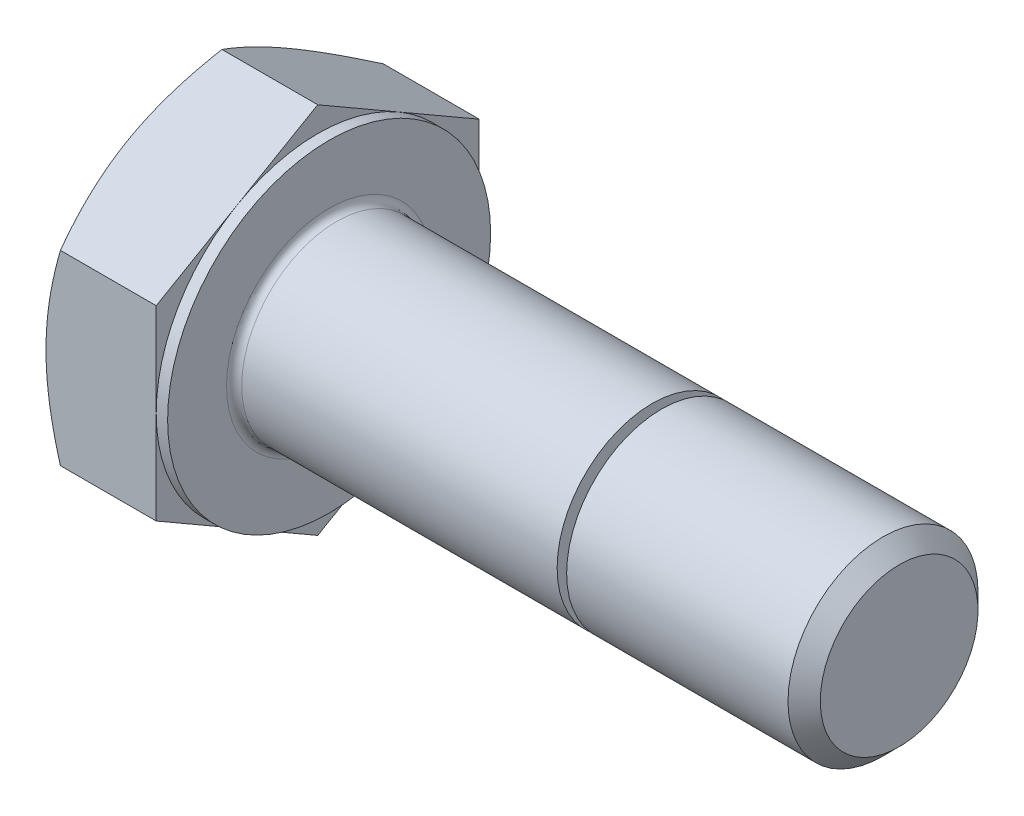
ISO-10303-21;
HEADER;
FILE_DESCRIPTION(('STEP AP214'),'2;1');
FILE_NAME('part.step','',(''),(''),'','','');
FILE_SCHEMA(('AUTOMOTIVE_DESIGN { 1 0 10303 214 1 1 1 1 }'));
ENDSEC;
DATA;
#1=APPLICATION_CONTEXT('core data for automotive mechanical design processes');
#2=APPLICATION_PROTOCOL_DEFINITION('international standard','automotive_design',2000,#1);
#3=PRODUCT_CONTEXT('',#1,'mechanical');
#4=PRODUCT('Part','Part','',(#3));
#5=PRODUCT_RELATED_PRODUCT_CATEGORY('part','',(#4));
#6=PRODUCT_DEFINITION_FORMATION('','',#4);
#7=PRODUCT_DEFINITION_CONTEXT('part definition',#1,'design');
#8=PRODUCT_DEFINITION('design','',#6,#7);
#9=PRODUCT_DEFINITION_SHAPE('','',#8);
#10=(LENGTH_UNIT() NAMED_UNIT(*) SI_UNIT(.MILLI.,.METRE.));
#11=(NAMED_UNIT(*) PLANE_ANGLE_UNIT() SI_UNIT($,.RADIAN.));
#12=(NAMED_UNIT(*) SI_UNIT($,.STERADIAN.) SOLID_ANGLE_UNIT());
#13=UNCERTAINTY_MEASURE_WITH_UNIT(LENGTH_MEASURE(1.E-05),#10,'distance_accuracy_value','');
#14=(GEOMETRIC_REPRESENTATION_CONTEXT(3) GLOBAL_UNCERTAINTY_ASSIGNED_CONTEXT((#13)) GLOBAL_UNIT_ASSIGNED_CONTEXT((#10,
#11,#12)) REPRESENTATION_CONTEXT('',''));
#15=CARTESIAN_POINT('',(0.,0.,0.));
#16=DIRECTION('',(0.,0.,1.));
#17=DIRECTION('',(1.,0.,0.));
#18=AXIS2_PLACEMENT_3D('',#15,#16,#17);
#19=CARTESIAN_POINT('',(6.4,9.814954576,0.));
#20=DIRECTION('',(-1.,0.,0.));
#21=DIRECTION('',(0.,0.,1.));
#22=AXIS2_PLACEMENT_3D('',#19,#20,#21);
#23=PLANE('',#22);
#24=CARTESIAN_POINT('',(6.4,0.,0.));
#25=DIRECTION('',(1.,0.,0.));
#26=DIRECTION('',(0.,0.,1.));
#27=AXIS2_PLACEMENT_3D('',#24,#25,#26);
#28=CIRCLE('',#27,5.4);
#29=CARTESIAN_POINT('',(6.4,0.,-5.4));
#30=VERTEX_POINT('',#29);
#31=EDGE_CURVE('E187',#30,#30,#28,.T.);
#32=ORIENTED_EDGE('',*,*,#31,.F.);
#33=EDGE_LOOP('',(#32));
#34=FACE_BOUND('',#33,.T.);
#35=CARTESIAN_POINT('',(6.4,0.,0.));
#36=DIRECTION('',(-1.,0.,0.));
#37=DIRECTION('',(0.,0.,1.));
#38=AXIS2_PLACEMENT_3D('',#35,#36,#37);
#39=CIRCLE('',#38,8.5);
#40=CARTESIAN_POINT('',(6.4,0.,8.5));
#41=VERTEX_POINT('',#40);
#42=EDGE_CURVE('E257',#41,#41,#39,.T.);
#43=ORIENTED_EDGE('',*,*,#42,.F.);
#44=EDGE_LOOP('',(#43));
#45=FACE_BOUND('',#44,.T.);
#46=ADVANCED_FACE('F17',(#34,#45),#23,.F.);
#47=CARTESIAN_POINT('',(36.4,0.,0.));
#48=DIRECTION('',(1.,0.,0.));
#49=DIRECTION('',(0.,1.,0.));
#50=AXIS2_PLACEMENT_3D('',#47,#48,#49);
#51=PLANE('',#50);
#52=CARTESIAN_POINT('',(36.4,0.,0.));
#53=DIRECTION('',(-1.,0.,0.));
#54=DIRECTION('',(0.,0.,1.));
#55=AXIS2_PLACEMENT_3D('',#52,#53,#54);
#56=CIRCLE('',#55,4.15);
#57=CARTESIAN_POINT('',(36.4,-2.43930879701376,3.35742052665604));
#58=VERTEX_POINT('',#57);
#59=EDGE_CURVE('E185',#58,#58,#56,.T.);
#60=ORIENTED_EDGE('',*,*,#59,.F.);
#61=EDGE_LOOP('',(#60));
#62=FACE_BOUND('',#61,.T.);
#63=ADVANCED_FACE('F503',(#62),#51,.T.);
#64=CARTESIAN_POINT('',(5.8,8.5,0.));
#65=DIRECTION('',(-1.,0.,0.));
#66=DIRECTION('',(0.,0.,1.));
#67=AXIS2_PLACEMENT_3D('',#64,#65,#66);
#68=PLANE('',#67);
#69=DIRECTION('',(0.,0.499999999991456,0.866025403789372));
#70=VECTOR('',#69,1.);
#71=CARTESIAN_POINT('',(5.8,-7.361215932,4.25));
#72=LINE('',#71,#70);
#73=CARTESIAN_POINT('',(5.8,-7.361215932,4.25));
#74=VERTEX_POINT('',#73);
#75=CARTESIAN_POINT('',(5.8,-4.907477288,8.5));
#76=VERTEX_POINT('',#75);
#77=EDGE_CURVE('E207',#74,#76,#72,.T.);
#78=ORIENTED_EDGE('',*,*,#77,.F.);
#79=CARTESIAN_POINT('',(5.8,0.,0.));
#80=DIRECTION('',(1.,0.,0.));
#81=DIRECTION('',(0.,0.,1.));
#82=AXIS2_PLACEMENT_3D('',#79,#80,#81);
#83=CIRCLE('',#82,8.5);
#84=CARTESIAN_POINT('',(5.8,0.,8.5));
#85=VERTEX_POINT('',#84);
#86=EDGE_CURVE('E260',#85,#74,#83,.T.);
#87=ORIENTED_EDGE('',*,*,#86,.F.);
#88=DIRECTION('',(0.,1.,0.));
#89=VECTOR('',#88,1.);
#90=CARTESIAN_POINT('',(5.8,-4.907477288,8.5));
#91=LINE('',#90,#89);
#92=EDGE_CURVE('E401',#76,#85,#91,.T.);
#93=ORIENTED_EDGE('',*,*,#92,.F.);
#94=EDGE_LOOP('',(#78,#87,#93));
#95=FACE_BOUND('',#94,.T.);
#96=ADVANCED_FACE('F513',(#95),#68,.F.);
#97=CARTESIAN_POINT('',(5.8,8.5,0.));
#98=DIRECTION('',(-1.,0.,0.));
#99=DIRECTION('',(0.,0.,1.));
#100=AXIS2_PLACEMENT_3D('',#97,#98,#99);
#101=PLANE('',#100);
#102=DIRECTION('',(0.,-0.499999999991455,0.866025403789372));
#103=VECTOR('',#102,1.);
#104=CARTESIAN_POINT('',(5.8,-7.361215932,-4.25));
#105=LINE('',#104,#103);
#106=CARTESIAN_POINT('',(5.8,-7.361215932,-4.25));
#107=VERTEX_POINT('',#106);
#108=CARTESIAN_POINT('',(5.8,-9.814954576,0.));
#109=VERTEX_POINT('',#108);
#110=EDGE_CURVE('E378',#107,#109,#105,.T.);
#111=ORIENTED_EDGE('',*,*,#110,.F.);
#112=CARTESIAN_POINT('',(5.8,0.,0.));
#113=DIRECTION('',(1.,0.,0.));
#114=DIRECTION('',(0.,-0.866025403784446,0.499999999999987));
#115=AXIS2_PLACEMENT_3D('',#112,#113,#114);
#116=CIRCLE('',#115,8.5);
#117=EDGE_CURVE('E274',#74,#107,#116,.T.);
#118=ORIENTED_EDGE('',*,*,#117,.F.);
#119=DIRECTION('',(0.,0.499999999991455,0.866025403789372));
#120=VECTOR('',#119,1.);
#121=CARTESIAN_POINT('',(5.8,-9.814954576,0.));
#122=LINE('',#121,#120);
#123=EDGE_CURVE('E204',#109,#74,#122,.T.);
#124=ORIENTED_EDGE('',*,*,#123,.F.);
#125=EDGE_LOOP('',(#111,#118,#124));
#126=FACE_BOUND('',#125,.T.);
#127=ADVANCED_FACE('F515',(#126),#101,.F.);
#128=CARTESIAN_POINT('',(5.8,8.5,0.));
#129=DIRECTION('',(-1.,0.,0.));
#130=DIRECTION('',(0.,0.,1.));
#131=AXIS2_PLACEMENT_3D('',#128,#129,#130);
#132=PLANE('',#131);
#133=DIRECTION('',(0.,-1.,0.));
#134=VECTOR('',#133,1.);
#135=CARTESIAN_POINT('',(5.8,0.,-8.5));
#136=LINE('',#135,#134);
#137=CARTESIAN_POINT('',(5.8,0.,-8.5));
#138=VERTEX_POINT('',#137);
#139=CARTESIAN_POINT('',(5.8,-4.907477288,-8.5));
#140=VERTEX_POINT('',#139);
#141=EDGE_CURVE('E359',#138,#140,#136,.T.);
#142=ORIENTED_EDGE('',*,*,#141,.F.);
#143=CARTESIAN_POINT('',(5.8,0.,0.));
#144=DIRECTION('',(1.,0.,0.));
#145=DIRECTION('',(0.,-0.866025403784431,-0.500000000000014));
#146=AXIS2_PLACEMENT_3D('',#143,#144,#145);
#147=CIRCLE('',#146,8.5);
#148=EDGE_CURVE('E226',#107,#138,#147,.T.);
#149=ORIENTED_EDGE('',*,*,#148,.F.);
#150=DIRECTION('',(0.,-0.499999999991456,0.866025403789372));
#151=VECTOR('',#150,1.);
#152=CARTESIAN_POINT('',(5.8,-4.907477288,-8.5));
#153=LINE('',#152,#151);
#154=EDGE_CURVE('E292',#140,#107,#153,.T.);
#155=ORIENTED_EDGE('',*,*,#154,.F.);
#156=EDGE_LOOP('',(#142,#149,#155));
#157=FACE_BOUND('',#156,.T.);
#158=ADVANCED_FACE('F519',(#157),#132,.F.);
#159=CARTESIAN_POINT('',(5.8,8.5,0.));
#160=DIRECTION('',(-1.,0.,0.));
#161=DIRECTION('',(0.,0.,1.));
#162=AXIS2_PLACEMENT_3D('',#159,#160,#161);
#163=PLANE('',#162);
#164=DIRECTION('',(0.,-0.499999999991456,-0.866025403789372));
#165=VECTOR('',#164,1.);
#166=CARTESIAN_POINT('',(5.8,7.361215932,-4.25));
#167=LINE('',#166,#165);
#168=CARTESIAN_POINT('',(5.8,7.361215932,-4.25));
#169=VERTEX_POINT('',#168);
#170=CARTESIAN_POINT('',(5.8,4.907477288,-8.5));
#171=VERTEX_POINT('',#170);
#172=EDGE_CURVE('E340',#169,#171,#167,.T.);
#173=ORIENTED_EDGE('',*,*,#172,.F.);
#174=CARTESIAN_POINT('',(5.8,0.,0.));
#175=DIRECTION('',(1.,0.,0.));
#176=DIRECTION('',(0.,0.,-1.));
#177=AXIS2_PLACEMENT_3D('',#174,#175,#176);
#178=CIRCLE('',#177,8.5);
#179=EDGE_CURVE('E227',#138,#169,#178,.T.);
#180=ORIENTED_EDGE('',*,*,#179,.F.);
#181=DIRECTION('',(0.,-1.,0.));
#182=VECTOR('',#181,1.);
#183=CARTESIAN_POINT('',(5.8,4.907477288,-8.5));
#184=LINE('',#183,#182);
#185=EDGE_CURVE('E266',#171,#138,#184,.T.);
#186=ORIENTED_EDGE('',*,*,#185,.F.);
#187=EDGE_LOOP('',(#173,#180,#186));
#188=FACE_BOUND('',#187,.T.);
#189=ADVANCED_FACE('F522',(#188),#163,.F.);
#190=CARTESIAN_POINT('',(5.8,8.5,0.));
#191=DIRECTION('',(-1.,0.,0.));
#192=DIRECTION('',(0.,0.,1.));
#193=AXIS2_PLACEMENT_3D('',#190,#191,#192);
#194=PLANE('',#193);
#195=DIRECTION('',(0.,0.499999999991455,-0.866025403789372));
#196=VECTOR('',#195,1.);
#197=CARTESIAN_POINT('',(5.8,7.361215932,4.25));
#198=LINE('',#197,#196);
#199=CARTESIAN_POINT('',(5.8,7.361215932,4.25));
#200=VERTEX_POINT('',#199);
#201=CARTESIAN_POINT('',(5.8,9.814954576,0.));
#202=VERTEX_POINT('',#201);
#203=EDGE_CURVE('E282',#200,#202,#198,.T.);
#204=ORIENTED_EDGE('',*,*,#203,.F.);
#205=CARTESIAN_POINT('',(5.8,0.,0.));
#206=DIRECTION('',(1.,0.,0.));
#207=DIRECTION('',(0.,0.866025403784438,-0.5));
#208=AXIS2_PLACEMENT_3D('',#205,#206,#207);
#209=CIRCLE('',#208,8.5);
#210=EDGE_CURVE('E231',#169,#200,#209,.T.);
#211=ORIENTED_EDGE('',*,*,#210,.F.);
#212=DIRECTION('',(0.,-0.499999999991455,-0.866025403789372));
#213=VECTOR('',#212,1.);
#214=CARTESIAN_POINT('',(5.8,9.814954576,0.));
#215=LINE('',#214,#213);
#216=EDGE_CURVE('E336',#202,#169,#215,.T.);
#217=ORIENTED_EDGE('',*,*,#216,.F.);
#218=EDGE_LOOP('',(#204,#211,#217));
#219=FACE_BOUND('',#218,.T.);
#220=ADVANCED_FACE('F524',(#219),#194,.F.);
#221=CARTESIAN_POINT('',(5.8,8.5,0.));
#222=DIRECTION('',(-1.,0.,0.));
#223=DIRECTION('',(0.,0.,1.));
#224=AXIS2_PLACEMENT_3D('',#221,#222,#223);
#225=PLANE('',#224);
#226=DIRECTION('',(0.,0.499999999991456,-0.866025403789372));
#227=VECTOR('',#226,1.);
#228=CARTESIAN_POINT('',(5.8,4.907477288,8.5));
#229=LINE('',#228,#227);
#230=CARTESIAN_POINT('',(5.8,4.907477288,8.5));
#231=VERTEX_POINT('',#230);
#232=EDGE_CURVE('E278',#231,#200,#229,.T.);
#233=ORIENTED_EDGE('',*,*,#232,.F.);
#234=DIRECTION('',(0.,1.,0.));
#235=VECTOR('',#234,1.);
#236=CARTESIAN_POINT('',(5.8,0.,8.5));
#237=LINE('',#236,#235);
#238=EDGE_CURVE('E410',#85,#231,#237,.T.);
#239=ORIENTED_EDGE('',*,*,#238,.F.);
#240=CARTESIAN_POINT('',(5.8,0.,0.));
#241=DIRECTION('',(1.,0.,0.));
#242=DIRECTION('',(0.,0.866025403784438,0.5));
#243=AXIS2_PLACEMENT_3D('',#240,#241,#242);
#244=CIRCLE('',#243,8.5);
#245=EDGE_CURVE('E239',#200,#85,#244,.T.);
#246=ORIENTED_EDGE('',*,*,#245,.F.);
#247=EDGE_LOOP('',(#233,#239,#246));
#248=FACE_BOUND('',#247,.T.);
#249=ADVANCED_FACE('F530',(#248),#225,.F.);
#250=CARTESIAN_POINT('',(0.,9.814954576,0.));
#251=DIRECTION('',(-1.,0.,0.));
#252=DIRECTION('',(0.,0.,1.));
#253=AXIS2_PLACEMENT_3D('',#250,#251,#252);
#254=PLANE('',#253);
#255=CARTESIAN_POINT('',(0.,0.,0.));
#256=DIRECTION('',(-1.,0.,0.));
#257=DIRECTION('',(0.,0.,1.));
#258=AXIS2_PLACEMENT_3D('',#255,#256,#257);
#259=CIRCLE('',#258,8.5);
#260=CARTESIAN_POINT('',(0.,0.,8.5));
#261=VERTEX_POINT('',#260);
#262=CARTESIAN_POINT('',(0.,7.361215932,4.25));
#263=VERTEX_POINT('',#262);
#264=EDGE_CURVE('E11',#261,#263,#259,.T.);
#265=ORIENTED_EDGE('',*,*,#264,.T.);
#266=CARTESIAN_POINT('',(0.,0.,0.));
#267=DIRECTION('',(-1.,0.,0.));
#268=DIRECTION('',(0.,0.866025403784438,0.5));
#269=AXIS2_PLACEMENT_3D('',#266,#267,#268);
#270=CIRCLE('',#269,8.5);
#271=CARTESIAN_POINT('',(0.,7.361215932,-4.25));
#272=VERTEX_POINT('',#271);
#273=EDGE_CURVE('E25',#263,#272,#270,.T.);
#274=ORIENTED_EDGE('',*,*,#273,.T.);
#275=CARTESIAN_POINT('',(0.,0.,0.));
#276=DIRECTION('',(1.,0.,0.));
#277=DIRECTION('',(0.,0.,-1.));
#278=AXIS2_PLACEMENT_3D('',#275,#276,#277);
#279=CIRCLE('',#278,8.5);
#280=CARTESIAN_POINT('',(0.,0.,-8.5));
#281=VERTEX_POINT('',#280);
#282=EDGE_CURVE('E385',#281,#272,#279,.T.);
#283=ORIENTED_EDGE('',*,*,#282,.F.);
#284=CARTESIAN_POINT('',(0.,0.,0.));
#285=DIRECTION('',(-1.,0.,0.));
#286=DIRECTION('',(0.,0.,-1.));
#287=AXIS2_PLACEMENT_3D('',#284,#285,#286);
#288=CIRCLE('',#287,8.5);
#289=CARTESIAN_POINT('',(0.,-7.361215932,-4.25));
#290=VERTEX_POINT('',#289);
#291=EDGE_CURVE('E382',#281,#290,#288,.T.);
#292=ORIENTED_EDGE('',*,*,#291,.T.);
#293=CARTESIAN_POINT('',(0.,0.,0.));
#294=DIRECTION('',(-1.,0.,0.));
#295=DIRECTION('',(0.,-0.866025403784444,-0.49999999999999));
#296=AXIS2_PLACEMENT_3D('',#293,#294,#295);
#297=CIRCLE('',#296,8.5);
#298=CARTESIAN_POINT('',(0.,-7.361215932,4.25));
#299=VERTEX_POINT('',#298);
#300=EDGE_CURVE('E44',#290,#299,#297,.T.);
#301=ORIENTED_EDGE('',*,*,#300,.T.);
#302=CARTESIAN_POINT('',(0.,0.,0.));
#303=DIRECTION('',(-1.,0.,0.));
#304=DIRECTION('',(0.,-0.866025403784432,0.500000000000012));
#305=AXIS2_PLACEMENT_3D('',#302,#303,#304);
#306=CIRCLE('',#305,8.5);
#307=EDGE_CURVE('E249',#299,#261,#306,.T.);
#308=ORIENTED_EDGE('',*,*,#307,.T.);
#309=EDGE_LOOP('',(#265,#274,#283,#292,#301,#308));
#310=FACE_BOUND('',#309,.T.);
#311=ADVANCED_FACE('F428',(#310),#254,.T.);
#312=CARTESIAN_POINT('',(0.687370063500056,0.,0.));
#313=DIRECTION('',(1.,0.,0.));
#314=DIRECTION('',(0.,0.587785252292474,0.809016994374947));
#315=AXIS2_PLACEMENT_3D('',#312,#313,#314);
#316=CONICAL_SURFACE('',#315,9.69055987360002,1.04719755120247);
#317=CARTESIAN_POINT('',(-3.6123028236179E-10,7.36121593154684,4.24999999982385));
#318=CARTESIAN_POINT('',(-1.9507866547565E-10,6.22243186396579,6.22243186421516));
#319=CARTESIAN_POINT('',(0.759189378550385,4.90747728793407,8.50000000011419));
#320=(BOUNDED_CURVE() B_SPLINE_CURVE(2,(#317,#318,#319),.UNSPECIFIED.,.F.,
.F.) B_SPLINE_CURVE_WITH_KNOTS((3,3),(1.96261324119927,2.78463308145665),
.UNSPECIFIED.) CURVE() GEOMETRIC_REPRESENTATION_ITEM() RATIONAL_B_SPLINE_CURVE((1.69282032312476,
1.6928203230961,1.57128129213758)) REPRESENTATION_ITEM(''));
#321=CARTESIAN_POINT('',(0.759189379,4.907477288,8.5));
#322=VERTEX_POINT('',#321);
#323=EDGE_CURVE('E316',#263,#322,#320,.T.);
#324=ORIENTED_EDGE('',*,*,#323,.F.);
#325=ORIENTED_EDGE('',*,*,#264,.F.);
#326=CARTESIAN_POINT('',(0.759189378550386,4.90747728813186,8.50000000000001));
#327=CARTESIAN_POINT('',(0.,2.2775681356726,8.50000000000001));
#328=CARTESIAN_POINT('',(0.,0.,8.5));
#329=(BOUNDED_CURVE() B_SPLINE_CURVE(2,(#326,#327,#328),.UNSPECIFIED.,.F.,
.F.) B_SPLINE_CURVE_WITH_KNOTS((3,3),(1.14059340071008,1.96261324096582),
.UNSPECIFIED.) CURVE() GEOMETRIC_REPRESENTATION_ITEM() RATIONAL_B_SPLINE_CURVE((1.57128129211806,
1.69282032303694,1.69282032303695)) REPRESENTATION_ITEM(''));
#330=EDGE_CURVE('E250',#322,#261,#329,.T.);
#331=ORIENTED_EDGE('',*,*,#330,.F.);
#332=EDGE_LOOP('',(#324,#325,#331));
#333=FACE_BOUND('',#332,.T.);
#334=ADVANCED_FACE('F545',(#333),#316,.T.);
#335=CARTESIAN_POINT('',(0.687370063500056,0.,0.));
#336=DIRECTION('',(1.,0.,0.));
#337=DIRECTION('',(0.,0.587785252292474,0.809016994374947));
#338=AXIS2_PLACEMENT_3D('',#335,#336,#337);
#339=CONICAL_SURFACE('',#338,9.69055987360002,1.04719755120247);
#340=CARTESIAN_POINT('',(1.93613933889761E-10,7.36121593237913,-4.25000000030435));
#341=CARTESIAN_POINT('',(2.74674250522949E-11,8.50000000007917,-2.27756813570699));
#342=CARTESIAN_POINT('',(0.759189378461005,9.81495457607884,1.36552628096186E-10));
#343=(BOUNDED_CURVE() B_SPLINE_CURVE(2,(#340,#341,#342),.UNSPECIFIED.,.F.,
.F.) B_SPLINE_CURVE_WITH_KNOTS((3,3),(1.96261324075079,2.78463308105072),
.UNSPECIFIED.) CURVE() GEOMETRIC_REPRESENTATION_ITEM() RATIONAL_B_SPLINE_CURVE((1.6928203229899,
1.69282032301855,1.57128129212089)) REPRESENTATION_ITEM(''));
#344=CARTESIAN_POINT('',(0.759189378492819,9.81495457579647,-1.97129170330632E-10));
#345=VERTEX_POINT('',#344);
#346=EDGE_CURVE('E261',#272,#345,#343,.T.);
#347=ORIENTED_EDGE('',*,*,#346,.F.);
#348=ORIENTED_EDGE('',*,*,#273,.F.);
#349=CARTESIAN_POINT('',(0.759189378017451,9.81495457531058,-7.27940775002685E-10));
#350=CARTESIAN_POINT('',(-5.27382137960331E-10,8.49999999925537,2.27756813521179));
#351=CARTESIAN_POINT('',(-3.6123028236179E-10,7.36121593154684,4.24999999982385));
#352=(BOUNDED_CURVE() B_SPLINE_CURVE(2,(#349,#350,#351),.UNSPECIFIED.,.F.,
.F.) B_SPLINE_CURVE_WITH_KNOTS((3,3),(1.14059340082205,1.96261324119927),
.UNSPECIFIED.) CURVE() GEOMETRIC_REPRESENTATION_ITEM() RATIONAL_B_SPLINE_CURVE((1.57128129221677,
1.69282032315342,1.69282032312476)) REPRESENTATION_ITEM(''));
#353=EDGE_CURVE('E300',#345,#263,#352,.T.);
#354=ORIENTED_EDGE('',*,*,#353,.F.);
#355=EDGE_LOOP('',(#347,#348,#354));
#356=FACE_BOUND('',#355,.T.);
#357=ADVANCED_FACE('F437',(#356),#339,.T.);
#358=CARTESIAN_POINT('',(0.687370063500056,0.,0.));
#359=DIRECTION('',(1.,0.,0.));
#360=DIRECTION('',(0.,0.587785252292474,0.809016994374947));
#361=AXIS2_PLACEMENT_3D('',#358,#359,#360);
#362=CONICAL_SURFACE('',#361,9.69055987360002,1.04719755120247);
#363=CARTESIAN_POINT('',(0.,0.,-8.5));
#364=CARTESIAN_POINT('',(0.,2.27756813567261,-8.5));
#365=CARTESIAN_POINT('',(0.759189378550382,4.90747728813188,-8.49999999999999));
#366=(BOUNDED_CURVE() B_SPLINE_CURVE(2,(#363,#364,#365),.UNSPECIFIED.,.F.,
.F.) B_SPLINE_CURVE_WITH_KNOTS((3,3),(1.96261324096584,2.78463308122159),
.UNSPECIFIED.) CURVE() GEOMETRIC_REPRESENTATION_ITEM() RATIONAL_B_SPLINE_CURVE((1.69282032303695,
1.69282032303695,1.57128129211806)) REPRESENTATION_ITEM(''));
#367=CARTESIAN_POINT('',(0.759189379,4.907477288,-8.5));
#368=VERTEX_POINT('',#367);
#369=EDGE_CURVE('E287',#281,#368,#366,.T.);
#370=ORIENTED_EDGE('',*,*,#369,.F.);
#371=ORIENTED_EDGE('',*,*,#282,.T.);
#372=CARTESIAN_POINT('',(0.759189378993931,4.90747728883036,-8.50000000048384));
#373=CARTESIAN_POINT('',(3.59763108193079E-10,6.22243186480654,-6.22243186468099));
#374=CARTESIAN_POINT('',(1.93613933889762E-10,7.36121593237913,-4.25000000030437));
#375=(BOUNDED_CURVE() B_SPLINE_CURVE(2,(#372,#373,#374),.UNSPECIFIED.,.F.,
.F.) B_SPLINE_CURVE_WITH_KNOTS((3,3),(1.14059340057068,1.96261324075079),
.UNSPECIFIED.) CURVE() GEOMETRIC_REPRESENTATION_ITEM() RATIONAL_B_SPLINE_CURVE((1.5712812920417,
1.69282032296124,1.6928203229899)) REPRESENTATION_ITEM(''));
#376=EDGE_CURVE('E267',#368,#272,#375,.T.);
#377=ORIENTED_EDGE('',*,*,#376,.F.);
#378=EDGE_LOOP('',(#370,#371,#377));
#379=FACE_BOUND('',#378,.T.);
#380=ADVANCED_FACE('F436',(#379),#362,.T.);
#381=CARTESIAN_POINT('',(0.687370063500056,0.,0.));
#382=DIRECTION('',(1.,0.,0.));
#383=DIRECTION('',(0.,-0.499999999995726,-0.866025403786906));
#384=AXIS2_PLACEMENT_3D('',#381,#382,#383);
#385=CONICAL_SURFACE('',#384,9.69055987360002,1.04719755120247);
#386=CARTESIAN_POINT('',(0.759189378550364,-4.90747728813187,-8.5));
#387=CARTESIAN_POINT('',(0.,-2.2775681356726,-8.5));
#388=CARTESIAN_POINT('',(0.,0.,-8.5));
#389=(BOUNDED_CURVE() B_SPLINE_CURVE(2,(#386,#387,#388),.UNSPECIFIED.,.F.,
.F.) B_SPLINE_CURVE_WITH_KNOTS((3,3),(1.14059340071008,1.96261324096584),
.UNSPECIFIED.) CURVE() GEOMETRIC_REPRESENTATION_ITEM() RATIONAL_B_SPLINE_CURVE((1.57128129211807,
1.69282032303695,1.69282032303695)) REPRESENTATION_ITEM(''));
#390=CARTESIAN_POINT('',(0.759189379,-4.907477288,-8.5));
#391=VERTEX_POINT('',#390);
#392=EDGE_CURVE('E293',#391,#281,#389,.T.);
#393=ORIENTED_EDGE('',*,*,#392,.F.);
#394=CARTESIAN_POINT('',(1.93582715800486E-10,-7.36121593237912,-4.25000000030436));
#395=CARTESIAN_POINT('',(3.59735856797279E-10,-6.22243186480654,-6.22243186468098));
#396=CARTESIAN_POINT('',(0.759189378993909,-4.90747728883036,-8.50000000048382));
#397=(BOUNDED_CURVE() B_SPLINE_CURVE(2,(#394,#395,#396),.UNSPECIFIED.,.F.,
.F.) B_SPLINE_CURVE_WITH_KNOTS((3,3),(1.96261324113843,2.78463308131853),
.UNSPECIFIED.) CURVE() GEOMETRIC_REPRESENTATION_ITEM() RATIONAL_B_SPLINE_CURVE((1.69282032298991,
1.69282032296125,1.5712812920417)) REPRESENTATION_ITEM(''));
#398=EDGE_CURVE('E208',#290,#391,#397,.T.);
#399=ORIENTED_EDGE('',*,*,#398,.F.);
#400=ORIENTED_EDGE('',*,*,#291,.F.);
#401=EDGE_LOOP('',(#393,#399,#400));
#402=FACE_BOUND('',#401,.T.);
#403=ADVANCED_FACE('F449',(#402),#385,.T.);
#404=CARTESIAN_POINT('',(0.687370063500056,0.,0.));
#405=DIRECTION('',(1.,0.,0.));
#406=DIRECTION('',(0.,0.587785252292474,0.809016994374947));
#407=AXIS2_PLACEMENT_3D('',#404,#405,#406);
#408=CONICAL_SURFACE('',#407,9.69055987360002,1.04719755120247);
#409=CARTESIAN_POINT('',(0.759189378460967,-9.81495457607884,1.36548671294198E-10));
#410=CARTESIAN_POINT('',(2.74303912917162E-11,-8.50000000007916,-2.27756813570699));
#411=CARTESIAN_POINT('',(1.93582715800486E-10,-7.36121593237912,-4.25000000030435));
#412=(BOUNDED_CURVE() B_SPLINE_CURVE(2,(#409,#410,#411),.UNSPECIFIED.,.F.,
.F.) B_SPLINE_CURVE_WITH_KNOTS((3,3),(1.14059340083849,1.96261324113842),
.UNSPECIFIED.) CURVE() GEOMETRIC_REPRESENTATION_ITEM() RATIONAL_B_SPLINE_CURVE((1.57128129212089,
1.69282032301856,1.69282032298991)) REPRESENTATION_ITEM(''));
#413=CARTESIAN_POINT('',(0.759189378492798,-9.81495457579648,-1.97133645285259E-10));
#414=VERTEX_POINT('',#413);
#415=EDGE_CURVE('E301',#414,#290,#412,.T.);
#416=ORIENTED_EDGE('',*,*,#415,.F.);
#417=CARTESIAN_POINT('',(-3.61256122544925E-10,-7.36121593154684,4.24999999982386));
#418=CARTESIAN_POINT('',(-5.27412807622514E-10,-8.49999999925537,2.27756813521179));
#419=CARTESIAN_POINT('',(0.759189378017424,-9.81495457531058,-7.27951797522502E-10));
#420=(BOUNDED_CURVE() B_SPLINE_CURVE(2,(#417,#418,#419),.UNSPECIFIED.,.F.,
.F.) B_SPLINE_CURVE_WITH_KNOTS((3,3),(1.96261324081163,2.78463308118885),
.UNSPECIFIED.) CURVE() GEOMETRIC_REPRESENTATION_ITEM() RATIONAL_B_SPLINE_CURVE((1.69282032312476,
1.69282032315342,1.57128129221678)) REPRESENTATION_ITEM(''));
#421=EDGE_CURVE('E393',#299,#414,#420,.T.);
#422=ORIENTED_EDGE('',*,*,#421,.F.);
#423=ORIENTED_EDGE('',*,*,#300,.F.);
#424=EDGE_LOOP('',(#416,#422,#423));
#425=FACE_BOUND('',#424,.T.);
#426=ADVANCED_FACE('F453',(#425),#408,.T.);
#427=CARTESIAN_POINT('',(0.687370063500056,0.,0.));
#428=DIRECTION('',(1.,0.,0.));
#429=DIRECTION('',(0.,0.587785252292474,0.809016994374947));
#430=AXIS2_PLACEMENT_3D('',#427,#428,#429);
#431=CONICAL_SURFACE('',#430,9.69055987360002,1.04719755120247);
#432=CARTESIAN_POINT('',(0.759189378550371,-4.90747728793407,8.50000000011419));
#433=CARTESIAN_POINT('',(-1.9509954762853E-10,-6.22243186396579,6.22243186421517));
#434=CARTESIAN_POINT('',(-3.61256122544925E-10,-7.36121593154684,4.24999999982386));
#435=(BOUNDED_CURVE() B_SPLINE_CURVE(2,(#432,#433,#434),.UNSPECIFIED.,.F.,
.F.) B_SPLINE_CURVE_WITH_KNOTS((3,3),(1.14059340055424,1.96261324081163),
.UNSPECIFIED.) CURVE() GEOMETRIC_REPRESENTATION_ITEM() RATIONAL_B_SPLINE_CURVE((1.57128129213758,
1.69282032309611,1.69282032312476)) REPRESENTATION_ITEM(''));
#436=CARTESIAN_POINT('',(0.759189379,-4.907477288,8.5));
#437=VERTEX_POINT('',#436);
#438=EDGE_CURVE('E323',#437,#299,#435,.T.);
#439=ORIENTED_EDGE('',*,*,#438,.F.);
#440=CARTESIAN_POINT('',(0.,0.,8.50000000000001));
#441=CARTESIAN_POINT('',(0.,-2.2775681356726,8.5));
#442=CARTESIAN_POINT('',(0.759189378550372,-4.90747728813187,8.49999999999999));
#443=(BOUNDED_CURVE() B_SPLINE_CURVE(2,(#440,#441,#442),.UNSPECIFIED.,.F.,
.F.) B_SPLINE_CURVE_WITH_KNOTS((3,3),(1.96261324096582,2.78463308122158),
.UNSPECIFIED.) CURVE() GEOMETRIC_REPRESENTATION_ITEM() RATIONAL_B_SPLINE_CURVE((1.69282032303694,
1.69282032303695,1.57128129211806)) REPRESENTATION_ITEM(''));
#444=EDGE_CURVE('E244',#261,#437,#443,.T.);
#445=ORIENTED_EDGE('',*,*,#444,.F.);
#446=ORIENTED_EDGE('',*,*,#307,.F.);
#447=EDGE_LOOP('',(#439,#445,#446));
#448=FACE_BOUND('',#447,.T.);
#449=ADVANCED_FACE('F533',(#448),#431,.T.);
#450=CARTESIAN_POINT('',(6.4,4.907477288,8.5));
#451=DIRECTION('',(0.,0.,1.));
#452=DIRECTION('',(1.,0.,0.));
#453=AXIS2_PLACEMENT_3D('',#450,#451,#452);
#454=PLANE('',#453);
#455=ORIENTED_EDGE('',*,*,#92,.T.);
#456=ORIENTED_EDGE('',*,*,#238,.T.);
#457=DIRECTION('',(-1.,0.,0.));
#458=VECTOR('',#457,1.);
#459=CARTESIAN_POINT('',(5.8,4.907477288,8.5));
#460=LINE('',#459,#458);
#461=EDGE_CURVE('E329',#231,#322,#460,.T.);
#462=ORIENTED_EDGE('',*,*,#461,.T.);
#463=ORIENTED_EDGE('',*,*,#330,.T.);
#464=ORIENTED_EDGE('',*,*,#444,.T.);
#465=DIRECTION('',(-1.,0.,0.));
#466=VECTOR('',#465,1.);
#467=CARTESIAN_POINT('',(5.8,-4.907477288,8.5));
#468=LINE('',#467,#466);
#469=EDGE_CURVE('E235',#76,#437,#468,.T.);
#470=ORIENTED_EDGE('',*,*,#469,.F.);
#471=EDGE_LOOP('',(#455,#456,#462,#463,#464,#470));
#472=FACE_BOUND('',#471,.T.);
#473=ADVANCED_FACE('F532',(#472),#454,.T.);
#474=CARTESIAN_POINT('',(6.4,-4.907477288,8.5));
#475=DIRECTION('',(0.,-0.866025403838329,0.499999999906659));
#476=DIRECTION('',(-1.,0.,0.));
#477=AXIS2_PLACEMENT_3D('',#474,#475,#476);
#478=PLANE('',#477);
#479=ORIENTED_EDGE('',*,*,#123,.T.);
#480=ORIENTED_EDGE('',*,*,#77,.T.);
#481=ORIENTED_EDGE('',*,*,#469,.T.);
#482=ORIENTED_EDGE('',*,*,#438,.T.);
#483=ORIENTED_EDGE('',*,*,#421,.T.);
#484=DIRECTION('',(-1.,0.,0.));
#485=VECTOR('',#484,1.);
#486=CARTESIAN_POINT('',(5.8,-9.814954576,0.));
#487=LINE('',#486,#485);
#488=EDGE_CURVE('E307',#109,#414,#487,.T.);
#489=ORIENTED_EDGE('',*,*,#488,.F.);
#490=EDGE_LOOP('',(#479,#480,#481,#482,#483,#489));
#491=FACE_BOUND('',#490,.T.);
#492=ADVANCED_FACE('F458',(#491),#478,.T.);
#493=CARTESIAN_POINT('',(6.4,-9.814954576,0.));
#494=DIRECTION('',(0.,-0.866025403838329,-0.499999999906659));
#495=DIRECTION('',(0.,0.499999999906659,-0.866025403838329));
#496=AXIS2_PLACEMENT_3D('',#493,#494,#495);
#497=PLANE('',#496);
#498=ORIENTED_EDGE('',*,*,#154,.T.);
#499=ORIENTED_EDGE('',*,*,#110,.T.);
#500=ORIENTED_EDGE('',*,*,#488,.T.);
#501=ORIENTED_EDGE('',*,*,#415,.T.);
#502=ORIENTED_EDGE('',*,*,#398,.T.);
#503=DIRECTION('',(-1.,0.,0.));
#504=VECTOR('',#503,1.);
#505=CARTESIAN_POINT('',(5.8,-4.907477288,-8.5));
#506=LINE('',#505,#504);
#507=EDGE_CURVE('E363',#140,#391,#506,.T.);
#508=ORIENTED_EDGE('',*,*,#507,.F.);
#509=EDGE_LOOP('',(#498,#499,#500,#501,#502,#508));
#510=FACE_BOUND('',#509,.T.);
#511=ADVANCED_FACE('F517',(#510),#497,.T.);
#512=CARTESIAN_POINT('',(6.4,4.907477288,-8.5));
#513=DIRECTION('',(0.,0.,-1.));
#514=DIRECTION('',(0.,-1.,0.));
#515=AXIS2_PLACEMENT_3D('',#512,#513,#514);
#516=PLANE('',#515);
#517=ORIENTED_EDGE('',*,*,#185,.T.);
#518=ORIENTED_EDGE('',*,*,#141,.T.);
#519=ORIENTED_EDGE('',*,*,#507,.T.);
#520=ORIENTED_EDGE('',*,*,#392,.T.);
#521=ORIENTED_EDGE('',*,*,#369,.T.);
#522=DIRECTION('',(-1.,0.,0.));
#523=VECTOR('',#522,1.);
#524=CARTESIAN_POINT('',(5.8,4.907477288,-8.5));
#525=LINE('',#524,#523);
#526=EDGE_CURVE('E346',#171,#368,#525,.T.);
#527=ORIENTED_EDGE('',*,*,#526,.F.);
#528=EDGE_LOOP('',(#517,#518,#519,#520,#521,#527));
#529=FACE_BOUND('',#528,.T.);
#530=ADVANCED_FACE('F443',(#529),#516,.T.);
#531=CARTESIAN_POINT('',(6.4,9.814954576,0.));
#532=DIRECTION('',(0.,0.866025403838329,-0.499999999906659));
#533=DIRECTION('',(-1.,0.,0.));
#534=AXIS2_PLACEMENT_3D('',#531,#532,#533);
#535=PLANE('',#534);
#536=ORIENTED_EDGE('',*,*,#216,.T.);
#537=ORIENTED_EDGE('',*,*,#172,.T.);
#538=ORIENTED_EDGE('',*,*,#526,.T.);
#539=ORIENTED_EDGE('',*,*,#376,.T.);
#540=ORIENTED_EDGE('',*,*,#346,.T.);
#541=DIRECTION('',(-1.,0.,0.));
#542=VECTOR('',#541,1.);
#543=CARTESIAN_POINT('',(5.8,9.814954576,0.));
#544=LINE('',#543,#542);
#545=EDGE_CURVE('E286',#202,#345,#544,.T.);
#546=ORIENTED_EDGE('',*,*,#545,.F.);
#547=EDGE_LOOP('',(#536,#537,#538,#539,#540,#546));
#548=FACE_BOUND('',#547,.T.);
#549=ADVANCED_FACE('F440',(#548),#535,.T.);
#550=CARTESIAN_POINT('',(6.4,4.907477288,8.5));
#551=DIRECTION('',(0.,0.866025403838329,0.499999999906659));
#552=DIRECTION('',(1.,0.,0.));
#553=AXIS2_PLACEMENT_3D('',#550,#551,#552);
#554=PLANE('',#553);
#555=ORIENTED_EDGE('',*,*,#232,.T.);
#556=ORIENTED_EDGE('',*,*,#203,.T.);
#557=ORIENTED_EDGE('',*,*,#545,.T.);
#558=ORIENTED_EDGE('',*,*,#353,.T.);
#559=ORIENTED_EDGE('',*,*,#323,.T.);
#560=ORIENTED_EDGE('',*,*,#461,.F.);
#561=EDGE_LOOP('',(#555,#556,#557,#558,#559,#560));
#562=FACE_BOUND('',#561,.T.);
#563=ADVANCED_FACE('F528',(#562),#554,.T.);
#564=CARTESIAN_POINT('',(6.1,0.,0.));
#565=DIRECTION('',(1.,0.,0.));
#566=DIRECTION('',(0.,0.,-1.));
#567=AXIS2_PLACEMENT_3D('',#564,#565,#566);
#568=CYLINDRICAL_SURFACE('',#567,8.5);
#569=ORIENTED_EDGE('',*,*,#148,.T.);
#570=ORIENTED_EDGE('',*,*,#179,.T.);
#571=ORIENTED_EDGE('',*,*,#210,.T.);
#572=ORIENTED_EDGE('',*,*,#245,.T.);
#573=DIRECTION('',(1.,0.,0.));
#574=VECTOR('',#573,1.);
#575=CARTESIAN_POINT('',(6.1,0.,8.5));
#576=LINE('',#575,#574);
#577=EDGE_CURVE('E243',#85,#41,#576,.T.);
#578=ORIENTED_EDGE('',*,*,#577,.T.);
#579=ORIENTED_EDGE('',*,*,#42,.T.);
#580=ORIENTED_EDGE('',*,*,#577,.F.);
#581=ORIENTED_EDGE('',*,*,#86,.T.);
#582=ORIENTED_EDGE('',*,*,#117,.T.);
#583=EDGE_LOOP('',(#569,#570,#571,#572,#578,#579,#580,#581,#582));
#584=FACE_BOUND('',#583,.T.);
#585=ADVANCED_FACE('F507',(#584),#568,.T.);
#586=CARTESIAN_POINT('',(21.175,0.,0.));
#587=DIRECTION('',(1.,0.,0.));
#588=DIRECTION('',(0.,0.,-1.));
#589=AXIS2_PLACEMENT_3D('',#586,#587,#588);
#590=CYLINDRICAL_SURFACE('',#589,5.);
#591=CARTESIAN_POINT('',(6.8,0.,0.));
#592=DIRECTION('',(-1.,0.,0.));
#593=DIRECTION('',(0.,0.,-1.));
#594=AXIS2_PLACEMENT_3D('',#591,#592,#593);
#595=CIRCLE('',#594,5.);
#596=CARTESIAN_POINT('',(6.8,0.,5.));
#597=VERTEX_POINT('',#596);
#598=CARTESIAN_POINT('',(6.8,0.,-5.));
#599=VERTEX_POINT('',#598);
#600=EDGE_CURVE('E212',#597,#599,#595,.T.);
#601=ORIENTED_EDGE('',*,*,#600,.F.);
#602=DIRECTION('',(1.,0.,0.));
#603=VECTOR('',#602,1.);
#604=CARTESIAN_POINT('',(21.175,0.,5.));
#605=LINE('',#604,#603);
#606=CARTESIAN_POINT('',(23.4,0.,5.));
#607=VERTEX_POINT('',#606);
#608=EDGE_CURVE('E223',#597,#607,#605,.T.);
#609=ORIENTED_EDGE('',*,*,#608,.T.);
#610=CARTESIAN_POINT('',(23.4,0.,0.));
#611=DIRECTION('',(1.,0.,0.));
#612=DIRECTION('',(0.,0.,-1.));
#613=AXIS2_PLACEMENT_3D('',#610,#611,#612);
#614=CIRCLE('',#613,5.);
#615=EDGE_CURVE('E481',#607,#607,#614,.T.);
#616=ORIENTED_EDGE('',*,*,#615,.F.);
#617=ORIENTED_EDGE('',*,*,#608,.F.);
#618=CARTESIAN_POINT('',(6.8,0.,0.));
#619=DIRECTION('',(-1.,0.,0.));
#620=DIRECTION('',(0.,0.,-1.));
#621=AXIS2_PLACEMENT_3D('',#618,#619,#620);
#622=CIRCLE('',#621,5.);
#623=EDGE_CURVE('E209',#599,#597,#622,.T.);
#624=ORIENTED_EDGE('',*,*,#623,.F.);
#625=EDGE_LOOP('',(#601,#609,#616,#617,#624));
#626=FACE_BOUND('',#625,.T.);
#627=ADVANCED_FACE('F495',(#626),#590,.T.);
#628=CARTESIAN_POINT('',(6.8,0.,0.));
#629=DIRECTION('',(1.,0.,0.));
#630=DIRECTION('',(0.,0.,1.));
#631=AXIS2_PLACEMENT_3D('',#628,#629,#630);
#632=TOROIDAL_SURFACE('',#631,5.4,0.4);
#633=ORIENTED_EDGE('',*,*,#31,.T.);
#634=CARTESIAN_POINT('',(6.8,0.,-5.4));
#635=DIRECTION('',(0.,1.,0.));
#636=DIRECTION('',(0.,0.,-1.));
#637=AXIS2_PLACEMENT_3D('',#634,#635,#636);
#638=CIRCLE('',#637,0.4);
#639=EDGE_CURVE('E213',#30,#599,#638,.T.);
#640=ORIENTED_EDGE('',*,*,#639,.T.);
#641=ORIENTED_EDGE('',*,*,#623,.T.);
#642=ORIENTED_EDGE('',*,*,#600,.T.);
#643=ORIENTED_EDGE('',*,*,#639,.F.);
#644=EDGE_LOOP('',(#633,#640,#641,#642,#643));
#645=FACE_BOUND('',#644,.T.);
#646=ADVANCED_FACE('F498',(#645),#632,.F.);
#647=CARTESIAN_POINT('',(35.635,0.,0.));
#648=DIRECTION('',(-1.,0.,0.));
#649=DIRECTION('',(0.,0.587785252292472,-0.809016994374948));
#650=AXIS2_PLACEMENT_3D('',#647,#648,#649);
#651=CONICAL_SURFACE('',#650,4.915,0.785398163397447);
#652=ORIENTED_EDGE('',*,*,#59,.T.);
#653=DIRECTION('',(-0.707106781186548,-0.415626937777453,0.572061402817684));
#654=VECTOR('',#653,1.);
#655=CARTESIAN_POINT('',(35.635,-2.88896451501749,3.97631852735286));
#656=LINE('',#655,#654);
#657=CARTESIAN_POINT('',(35.55,-2.93892626146237,4.04508497187476));
#658=VERTEX_POINT('',#657);
#659=EDGE_CURVE('E178',#58,#658,#656,.T.);
#660=ORIENTED_EDGE('',*,*,#659,.T.);
#661=CARTESIAN_POINT('',(35.55,0.,0.));
#662=DIRECTION('',(1.,0.,0.));
#663=DIRECTION('',(0.,0.,-1.));
#664=AXIS2_PLACEMENT_3D('',#661,#662,#663);
#665=CIRCLE('',#664,5.);
#666=CARTESIAN_POINT('',(35.55,0.,5.));
#667=VERTEX_POINT('',#666);
#668=EDGE_CURVE('E182',#658,#667,#665,.T.);
#669=ORIENTED_EDGE('',*,*,#668,.T.);
#670=CARTESIAN_POINT('',(35.55,0.,0.));
#671=DIRECTION('',(1.,0.,0.));
#672=DIRECTION('',(0.,0.,-1.));
#673=AXIS2_PLACEMENT_3D('',#670,#671,#672);
#674=CIRCLE('',#673,5.);
#675=EDGE_CURVE('E189',#667,#658,#674,.T.);
#676=ORIENTED_EDGE('',*,*,#675,.T.);
#677=ORIENTED_EDGE('',*,*,#659,.F.);
#678=EDGE_LOOP('',(#652,#660,#669,#676,#677));
#679=FACE_BOUND('',#678,.T.);
#680=ADVANCED_FACE('F180',(#679),#651,.T.);
#681=CARTESIAN_POINT('',(21.175,0.,0.));
#682=DIRECTION('',(1.,0.,0.));
#683=DIRECTION('',(0.,0.,-1.));
#684=AXIS2_PLACEMENT_3D('',#681,#682,#683);
#685=CYLINDRICAL_SURFACE('',#684,5.);
#686=CARTESIAN_POINT('',(23.9000017029569,0.,0.));
#687=DIRECTION('',(-1.,0.,0.));
#688=DIRECTION('',(0.,0.,-1.));
#689=AXIS2_PLACEMENT_3D('',#686,#687,#688);
#690=CIRCLE('',#689,5.);
#691=CARTESIAN_POINT('',(23.9000017029569,0.,5.));
#692=VERTEX_POINT('',#691);
#693=EDGE_CURVE('E201',#692,#692,#690,.T.);
#694=ORIENTED_EDGE('',*,*,#693,.F.);
#695=DIRECTION('',(1.,0.,0.));
#696=VECTOR('',#695,1.);
#697=CARTESIAN_POINT('',(21.175,0.,5.));
#698=LINE('',#697,#696);
#699=EDGE_CURVE('E195',#692,#667,#698,.T.);
#700=ORIENTED_EDGE('',*,*,#699,.T.);
#701=ORIENTED_EDGE('',*,*,#668,.F.);
#702=ORIENTED_EDGE('',*,*,#675,.F.);
#703=ORIENTED_EDGE('',*,*,#699,.F.);
#704=EDGE_LOOP('',(#694,#700,#701,#702,#703));
#705=FACE_BOUND('',#704,.T.);
#706=ADVANCED_FACE('F194',(#705),#685,.T.);
#707=CARTESIAN_POINT('',(23.9000017029569,-60.104076400857,60.1040764008552));
#708=DIRECTION('',(-1.,0.,0.));
#709=DIRECTION('',(0.,0.,1.));
#710=AXIS2_PLACEMENT_3D('',#707,#708,#709);
#711=PLANE('',#710);
#712=CARTESIAN_POINT('',(23.9000017029569,1.4299672557172E-10,-1.44808609547908E-10));
#713=DIRECTION('',(1.,0.,0.));
#714=DIRECTION('',(0.,0.,-1.));
#715=AXIS2_PLACEMENT_3D('',#712,#713,#714);
#716=CIRCLE('',#715,4.25);
#717=CARTESIAN_POINT('',(23.9000017029569,1.4299724604661E-10,4.24999999985519));
#718=VERTEX_POINT('',#717);
#719=EDGE_CURVE('E482',#718,#718,#716,.T.);
#720=ORIENTED_EDGE('',*,*,#719,.T.);
#721=EDGE_LOOP('',(#720));
#722=FACE_BOUND('',#721,.T.);
#723=ORIENTED_EDGE('',*,*,#693,.T.);
#724=EDGE_LOOP('',(#723));
#725=FACE_BOUND('',#724,.T.);
#726=ADVANCED_FACE('F732',(#722,#725),#711,.T.);
#727=CARTESIAN_POINT('',(23.4,-60.104076400857,60.1040764008552));
#728=DIRECTION('',(-1.,0.,0.));
#729=DIRECTION('',(0.,0.,1.));
#730=AXIS2_PLACEMENT_3D('',#727,#728,#729);
#731=PLANE('',#730);
#732=CARTESIAN_POINT('',(23.4,1.4299672557172E-10,-1.44808609547908E-10));
#733=DIRECTION('',(1.,0.,0.));
#734=DIRECTION('',(0.,0.,-1.));
#735=AXIS2_PLACEMENT_3D('',#732,#733,#734);
#736=CIRCLE('',#735,4.25);
#737=CARTESIAN_POINT('',(23.4,1.4299724604661E-10,4.24999999985519));
#738=VERTEX_POINT('',#737);
#739=EDGE_CURVE('E776',#738,#738,#736,.T.);
#740=ORIENTED_EDGE('',*,*,#739,.F.);
#741=EDGE_LOOP('',(#740));
#742=FACE_BOUND('',#741,.T.);
#743=ORIENTED_EDGE('',*,*,#615,.T.);
#744=EDGE_LOOP('',(#743));
#745=FACE_BOUND('',#744,.T.);
#746=ADVANCED_FACE('F492',(#742,#745),#731,.F.);
#747=CARTESIAN_POINT('',(23.4,1.4299672557172E-10,-1.44808609547908E-10));
#748=DIRECTION('',(-1.,0.,0.));
#749=DIRECTION('',(0.,0.,-1.));
#750=AXIS2_PLACEMENT_3D('',#747,#748,#749);
#751=CYLINDRICAL_SURFACE('',#750,4.25);
#752=ORIENTED_EDGE('',*,*,#739,.T.);
#753=DIRECTION('',(1.,0.,0.));
#754=VECTOR('',#753,1.);
#755=CARTESIAN_POINT('',(23.4,1.4299724604661E-10,4.24999999985519));
#756=LINE('',#755,#754);
#757=EDGE_CURVE('E471',#738,#718,#756,.T.);
#758=ORIENTED_EDGE('',*,*,#757,.T.);
#759=ORIENTED_EDGE('',*,*,#719,.F.);
#760=ORIENTED_EDGE('',*,*,#757,.F.);
#761=EDGE_LOOP('',(#752,#758,#759,#760));
#762=FACE_BOUND('',#761,.T.);
#763=ADVANCED_FACE('F752',(#762),#751,.T.);
#764=CLOSED_SHELL('',(#46,#63,#96,#127,#158,#189,#220,#249,#311,#334,#357,#380,#403,#426,#449,
#473,#492,#511,#530,#549,#563,#585,#627,#646,#680,#706,#726,#746,#763));
#765=MANIFOLD_SOLID_BREP('B1',#764);
#766=ADVANCED_BREP_SHAPE_REPRESENTATION('',(#18,#765),#14);
#767=SHAPE_DEFINITION_REPRESENTATION(#9,#766);
ENDSEC;
END-ISO-10303-21;
